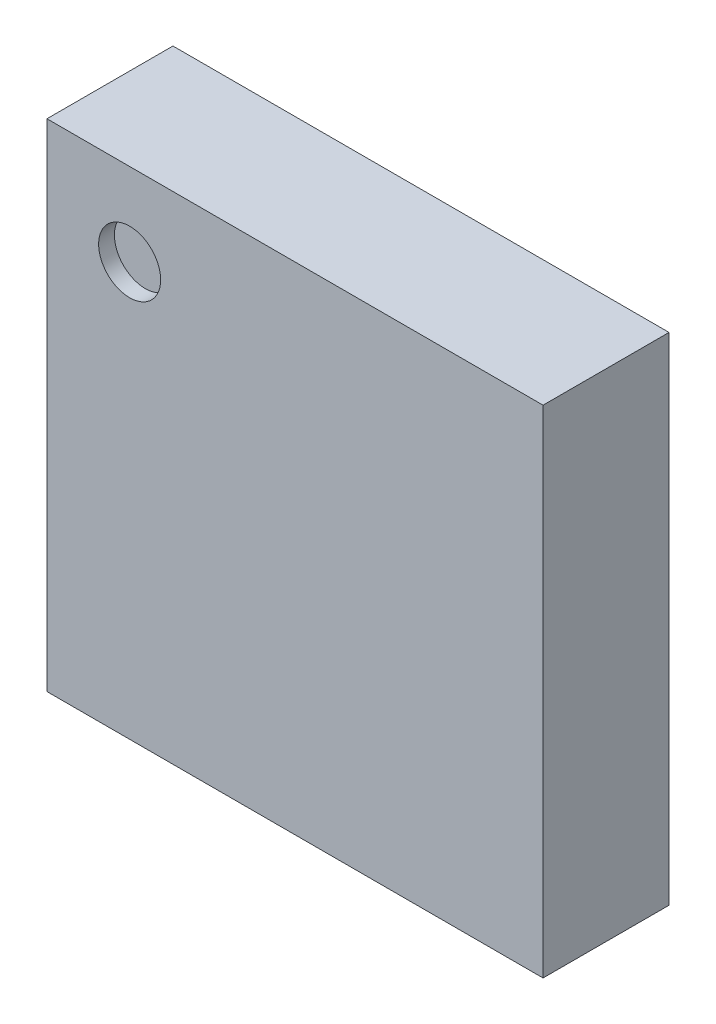
ISO-10303-21;
HEADER;
FILE_DESCRIPTION(('STEP AP214'),'2;1');
FILE_NAME('part.step','',(''),(''),'','','');
FILE_SCHEMA(('AUTOMOTIVE_DESIGN { 1 0 10303 214 1 1 1 1 }'));
ENDSEC;
DATA;
#1=APPLICATION_CONTEXT('core data for automotive mechanical design processes');
#2=APPLICATION_PROTOCOL_DEFINITION('international standard','automotive_design',2000,#1);
#3=PRODUCT_CONTEXT('',#1,'mechanical');
#4=PRODUCT('Part','Part','',(#3));
#5=PRODUCT_RELATED_PRODUCT_CATEGORY('part','',(#4));
#6=PRODUCT_DEFINITION_FORMATION('','',#4);
#7=PRODUCT_DEFINITION_CONTEXT('part definition',#1,'design');
#8=PRODUCT_DEFINITION('design','',#6,#7);
#9=PRODUCT_DEFINITION_SHAPE('','',#8);
#10=(LENGTH_UNIT() NAMED_UNIT(*) SI_UNIT(.MILLI.,.METRE.));
#11=(NAMED_UNIT(*) PLANE_ANGLE_UNIT() SI_UNIT($,.RADIAN.));
#12=(NAMED_UNIT(*) SI_UNIT($,.STERADIAN.) SOLID_ANGLE_UNIT());
#13=UNCERTAINTY_MEASURE_WITH_UNIT(LENGTH_MEASURE(1.E-05),#10,'distance_accuracy_value','');
#14=(GEOMETRIC_REPRESENTATION_CONTEXT(3) GLOBAL_UNCERTAINTY_ASSIGNED_CONTEXT((#13)) GLOBAL_UNIT_ASSIGNED_CONTEXT((#10,
#11,#12)) REPRESENTATION_CONTEXT('',''));
#15=CARTESIAN_POINT('',(0.,0.,0.));
#16=DIRECTION('',(0.,0.,1.));
#17=DIRECTION('',(1.,0.,0.));
#18=AXIS2_PLACEMENT_3D('',#15,#16,#17);
#19=CARTESIAN_POINT('',(0.525,2.625,0.7));
#20=DIRECTION('',(0.,0.,1.));
#21=DIRECTION('',(1.,0.,0.));
#22=AXIS2_PLACEMENT_3D('',#19,#20,#21);
#23=PLANE('',#22);
#24=CARTESIAN_POINT('',(0.525,2.625,0.7));
#25=DIRECTION('',(0.,0.,1.));
#26=DIRECTION('',(1.,0.,0.));
#27=AXIS2_PLACEMENT_3D('',#24,#25,#26);
#28=CIRCLE('',#27,0.196875);
#29=CARTESIAN_POINT('',(0.721875,2.625,0.7));
#30=VERTEX_POINT('',#29);
#31=EDGE_CURVE('E20',#30,#30,#28,.T.);
#32=ORIENTED_EDGE('',*,*,#31,.T.);
#33=EDGE_LOOP('',(#32));
#34=FACE_BOUND('',#33,.T.);
#35=ADVANCED_FACE('F17',(#34),#23,.T.);
#36=CARTESIAN_POINT('',(0.525,2.625,0.7));
#37=DIRECTION('',(0.,0.,1.));
#38=DIRECTION('',(1.,0.,0.));
#39=AXIS2_PLACEMENT_3D('',#36,#37,#38);
#40=CYLINDRICAL_SURFACE('',#39,0.196875);
#41=CARTESIAN_POINT('',(0.525,2.625,0.8));
#42=DIRECTION('',(0.,0.,1.));
#43=DIRECTION('',(1.,0.,0.));
#44=AXIS2_PLACEMENT_3D('',#41,#42,#43);
#45=CIRCLE('',#44,0.196875);
#46=CARTESIAN_POINT('',(0.721875,2.625,0.8));
#47=VERTEX_POINT('',#46);
#48=EDGE_CURVE('E66',#47,#47,#45,.F.);
#49=ORIENTED_EDGE('',*,*,#48,.F.);
#50=EDGE_LOOP('',(#49));
#51=FACE_BOUND('',#50,.T.);
#52=ORIENTED_EDGE('',*,*,#31,.F.);
#53=EDGE_LOOP('',(#52));
#54=FACE_BOUND('',#53,.T.);
#55=ADVANCED_FACE('F87',(#51,#54),#40,.F.);
#56=CARTESIAN_POINT('',(0.,0.,0.8));
#57=DIRECTION('',(0.,0.,1.));
#58=DIRECTION('',(1.,0.,0.));
#59=AXIS2_PLACEMENT_3D('',#56,#57,#58);
#60=PLANE('',#59);
#61=ORIENTED_EDGE('',*,*,#48,.T.);
#62=EDGE_LOOP('',(#61));
#63=FACE_BOUND('',#62,.T.);
#64=DIRECTION('',(0.,1.,0.));
#65=VECTOR('',#64,1.);
#66=CARTESIAN_POINT('',(3.15,0.,0.8));
#67=LINE('',#66,#65);
#68=CARTESIAN_POINT('',(3.15,3.15,0.8));
#69=VERTEX_POINT('',#68);
#70=CARTESIAN_POINT('',(3.15,0.,0.8));
#71=VERTEX_POINT('',#70);
#72=EDGE_CURVE('E166',#69,#71,#67,.F.);
#73=ORIENTED_EDGE('',*,*,#72,.F.);
#74=DIRECTION('',(1.,0.,0.));
#75=VECTOR('',#74,1.);
#76=CARTESIAN_POINT('',(0.,3.15,0.8));
#77=LINE('',#76,#75);
#78=CARTESIAN_POINT('',(0.,3.15,0.8));
#79=VERTEX_POINT('',#78);
#80=EDGE_CURVE('E60',#79,#69,#77,.T.);
#81=ORIENTED_EDGE('',*,*,#80,.F.);
#82=DIRECTION('',(0.,1.,0.));
#83=VECTOR('',#82,1.);
#84=CARTESIAN_POINT('',(0.,0.,0.8));
#85=LINE('',#84,#83);
#86=CARTESIAN_POINT('',(0.,0.,0.8));
#87=VERTEX_POINT('',#86);
#88=EDGE_CURVE('E58',#79,#87,#85,.F.);
#89=ORIENTED_EDGE('',*,*,#88,.T.);
#90=DIRECTION('',(1.,0.,0.));
#91=VECTOR('',#90,1.);
#92=CARTESIAN_POINT('',(0.,0.,0.8));
#93=LINE('',#92,#91);
#94=EDGE_CURVE('E55',#87,#71,#93,.T.);
#95=ORIENTED_EDGE('',*,*,#94,.T.);
#96=EDGE_LOOP('',(#73,#81,#89,#95));
#97=FACE_BOUND('',#96,.T.);
#98=ADVANCED_FACE('F59',(#63,#97),#60,.T.);
#99=CARTESIAN_POINT('',(0.,0.,0.));
#100=DIRECTION('',(1.,0.,0.));
#101=DIRECTION('',(0.,0.,-1.));
#102=AXIS2_PLACEMENT_3D('',#99,#100,#101);
#103=PLANE('',#102);
#104=DIRECTION('',(0.,0.,1.));
#105=VECTOR('',#104,1.);
#106=CARTESIAN_POINT('',(0.,3.15,0.));
#107=LINE('',#106,#105);
#108=CARTESIAN_POINT('',(0.,3.15,0.));
#109=VERTEX_POINT('',#108);
#110=EDGE_CURVE('E170',#109,#79,#107,.T.);
#111=ORIENTED_EDGE('',*,*,#110,.F.);
#112=DIRECTION('',(0.,1.,0.));
#113=VECTOR('',#112,1.);
#114=CARTESIAN_POINT('',(0.,0.,0.));
#115=LINE('',#114,#113);
#116=CARTESIAN_POINT('',(0.,0.,0.));
#117=VERTEX_POINT('',#116);
#118=EDGE_CURVE('E77',#109,#117,#115,.F.);
#119=ORIENTED_EDGE('',*,*,#118,.T.);
#120=DIRECTION('',(0.,0.,1.));
#121=VECTOR('',#120,1.);
#122=CARTESIAN_POINT('',(0.,0.,0.));
#123=LINE('',#122,#121);
#124=EDGE_CURVE('E65',#117,#87,#123,.T.);
#125=ORIENTED_EDGE('',*,*,#124,.T.);
#126=ORIENTED_EDGE('',*,*,#88,.F.);
#127=EDGE_LOOP('',(#111,#119,#125,#126));
#128=FACE_BOUND('',#127,.T.);
#129=ADVANCED_FACE('F76',(#128),#103,.F.);
#130=CARTESIAN_POINT('',(0.,0.,0.));
#131=DIRECTION('',(0.,1.,0.));
#132=DIRECTION('',(0.,0.,1.));
#133=AXIS2_PLACEMENT_3D('',#130,#131,#132);
#134=PLANE('',#133);
#135=ORIENTED_EDGE('',*,*,#94,.F.);
#136=ORIENTED_EDGE('',*,*,#124,.F.);
#137=DIRECTION('',(1.,0.,0.));
#138=VECTOR('',#137,1.);
#139=CARTESIAN_POINT('',(0.,0.,0.));
#140=LINE('',#139,#138);
#141=CARTESIAN_POINT('',(3.15,0.,0.));
#142=VERTEX_POINT('',#141);
#143=EDGE_CURVE('E168',#117,#142,#140,.T.);
#144=ORIENTED_EDGE('',*,*,#143,.T.);
#145=DIRECTION('',(0.,0.,-1.));
#146=VECTOR('',#145,1.);
#147=CARTESIAN_POINT('',(3.15,0.,0.));
#148=LINE('',#147,#146);
#149=EDGE_CURVE('E73',#71,#142,#148,.T.);
#150=ORIENTED_EDGE('',*,*,#149,.F.);
#151=EDGE_LOOP('',(#135,#136,#144,#150));
#152=FACE_BOUND('',#151,.T.);
#153=ADVANCED_FACE('F70',(#152),#134,.F.);
#154=CARTESIAN_POINT('',(3.15,0.,0.));
#155=DIRECTION('',(1.,0.,0.));
#156=DIRECTION('',(0.,0.,-1.));
#157=AXIS2_PLACEMENT_3D('',#154,#155,#156);
#158=PLANE('',#157);
#159=DIRECTION('',(0.,0.,1.));
#160=VECTOR('',#159,1.);
#161=CARTESIAN_POINT('',(3.15,3.15,0.));
#162=LINE('',#161,#160);
#163=CARTESIAN_POINT('',(3.15,3.15,0.));
#164=VERTEX_POINT('',#163);
#165=EDGE_CURVE('E34',#69,#164,#162,.F.);
#166=ORIENTED_EDGE('',*,*,#165,.F.);
#167=ORIENTED_EDGE('',*,*,#72,.T.);
#168=ORIENTED_EDGE('',*,*,#149,.T.);
#169=DIRECTION('',(0.,1.,0.));
#170=VECTOR('',#169,1.);
#171=CARTESIAN_POINT('',(3.15,0.,0.));
#172=LINE('',#171,#170);
#173=EDGE_CURVE('E26',#142,#164,#172,.T.);
#174=ORIENTED_EDGE('',*,*,#173,.T.);
#175=EDGE_LOOP('',(#166,#167,#168,#174));
#176=FACE_BOUND('',#175,.T.);
#177=ADVANCED_FACE('F104',(#176),#158,.T.);
#178=CARTESIAN_POINT('',(0.,3.15,0.));
#179=DIRECTION('',(0.,1.,0.));
#180=DIRECTION('',(0.,0.,1.));
#181=AXIS2_PLACEMENT_3D('',#178,#179,#180);
#182=PLANE('',#181);
#183=ORIENTED_EDGE('',*,*,#80,.T.);
#184=ORIENTED_EDGE('',*,*,#165,.T.);
#185=DIRECTION('',(1.,0.,0.));
#186=VECTOR('',#185,1.);
#187=CARTESIAN_POINT('',(0.,3.15,0.));
#188=LINE('',#187,#186);
#189=EDGE_CURVE('E11',#164,#109,#188,.F.);
#190=ORIENTED_EDGE('',*,*,#189,.T.);
#191=ORIENTED_EDGE('',*,*,#110,.T.);
#192=EDGE_LOOP('',(#183,#184,#190,#191));
#193=FACE_BOUND('',#192,.T.);
#194=ADVANCED_FACE('F98',(#193),#182,.T.);
#195=CARTESIAN_POINT('',(0.,0.,0.));
#196=DIRECTION('',(0.,0.,1.));
#197=DIRECTION('',(1.,0.,0.));
#198=AXIS2_PLACEMENT_3D('',#195,#196,#197);
#199=PLANE('',#198);
#200=ORIENTED_EDGE('',*,*,#173,.F.);
#201=ORIENTED_EDGE('',*,*,#143,.F.);
#202=ORIENTED_EDGE('',*,*,#118,.F.);
#203=ORIENTED_EDGE('',*,*,#189,.F.);
#204=EDGE_LOOP('',(#200,#201,#202,#203));
#205=FACE_BOUND('',#204,.T.);
#206=ADVANCED_FACE('F96',(#205),#199,.F.);
#207=CLOSED_SHELL('',(#35,#55,#98,#129,#153,#177,#194,#206));
#208=MANIFOLD_SOLID_BREP('B1',#207);
#209=ADVANCED_BREP_SHAPE_REPRESENTATION('',(#18,#208),#14);
#210=SHAPE_DEFINITION_REPRESENTATION(#9,#209);
ENDSEC;
END-ISO-10303-21;
